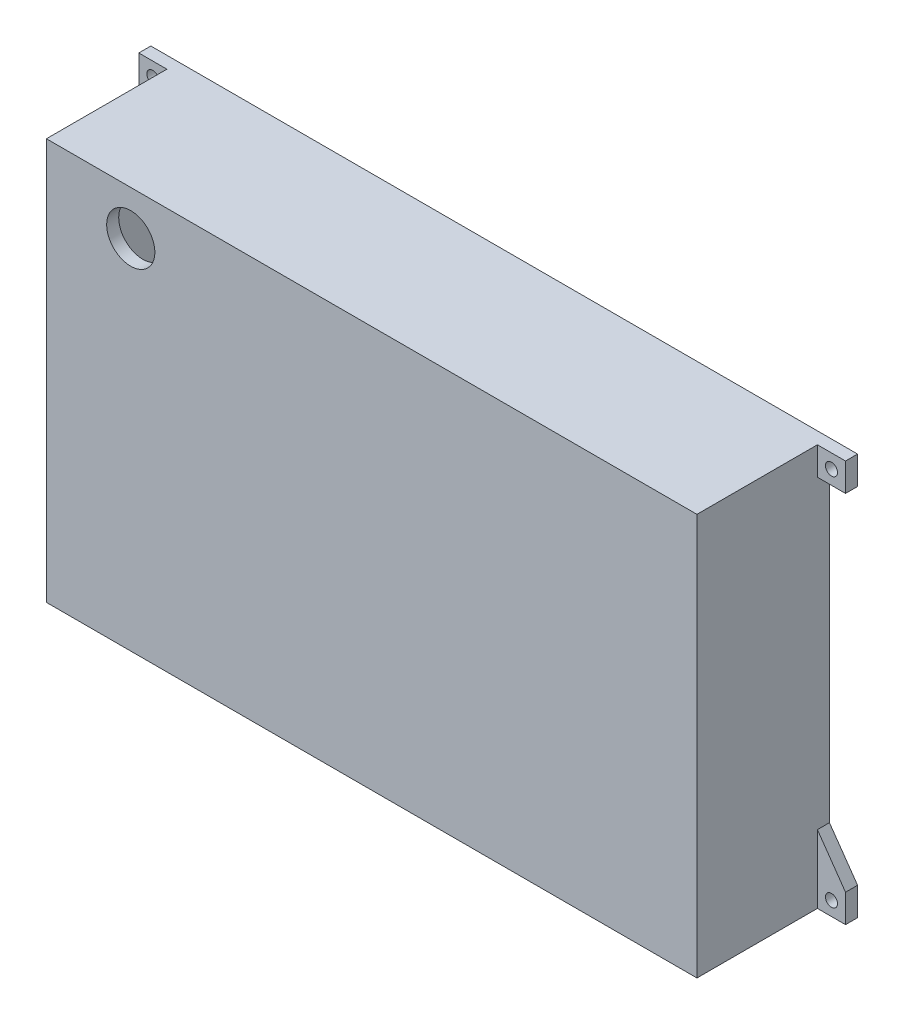
ISO-10303-21;
HEADER;
FILE_DESCRIPTION(('STEP AP214'),'2;1');
FILE_NAME('part.step','',(''),(''),'','','');
FILE_SCHEMA(('AUTOMOTIVE_DESIGN { 1 0 10303 214 1 1 1 1 }'));
ENDSEC;
DATA;
#1=APPLICATION_CONTEXT('core data for automotive mechanical design processes');
#2=APPLICATION_PROTOCOL_DEFINITION('international standard','automotive_design',2000,#1);
#3=PRODUCT_CONTEXT('',#1,'mechanical');
#4=PRODUCT('Part','Part','',(#3));
#5=PRODUCT_RELATED_PRODUCT_CATEGORY('part','',(#4));
#6=PRODUCT_DEFINITION_FORMATION('','',#4);
#7=PRODUCT_DEFINITION_CONTEXT('part definition',#1,'design');
#8=PRODUCT_DEFINITION('design','',#6,#7);
#9=PRODUCT_DEFINITION_SHAPE('','',#8);
#10=(LENGTH_UNIT() NAMED_UNIT(*) SI_UNIT(.MILLI.,.METRE.));
#11=(NAMED_UNIT(*) PLANE_ANGLE_UNIT() SI_UNIT($,.RADIAN.));
#12=(NAMED_UNIT(*) SI_UNIT($,.STERADIAN.) SOLID_ANGLE_UNIT());
#13=UNCERTAINTY_MEASURE_WITH_UNIT(LENGTH_MEASURE(1.E-05),#10,'distance_accuracy_value','');
#14=(GEOMETRIC_REPRESENTATION_CONTEXT(3) GLOBAL_UNCERTAINTY_ASSIGNED_CONTEXT((#13)) GLOBAL_UNIT_ASSIGNED_CONTEXT((#10,
#11,#12)) REPRESENTATION_CONTEXT('',''));
#15=CARTESIAN_POINT('',(0.,0.,0.));
#16=DIRECTION('',(0.,0.,1.));
#17=DIRECTION('',(1.,0.,0.));
#18=AXIS2_PLACEMENT_3D('',#15,#16,#17);
#19=CARTESIAN_POINT('',(0.,0.,33.));
#20=DIRECTION('',(0.,1.,0.));
#21=DIRECTION('',(0.,0.,1.));
#22=AXIS2_PLACEMENT_3D('',#19,#20,#21);
#23=PLANE('',#22);
#24=DIRECTION('',(0.,0.,-1.));
#25=VECTOR('',#24,1.);
#26=CARTESIAN_POINT('',(2.99999999999998,0.,30.));
#27=LINE('',#26,#25);
#28=CARTESIAN_POINT('',(2.99999999999998,0.,30.));
#29=VERTEX_POINT('',#28);
#30=CARTESIAN_POINT('',(2.99999999999998,0.,0.));
#31=VERTEX_POINT('',#30);
#32=EDGE_CURVE('E198',#29,#31,#27,.T.);
#33=ORIENTED_EDGE('',*,*,#32,.F.);
#34=DIRECTION('',(-1.,0.,0.));
#35=VECTOR('',#34,1.);
#36=CARTESIAN_POINT('',(159.,0.,30.));
#37=LINE('',#36,#35);
#38=CARTESIAN_POINT('',(159.,0.,30.));
#39=VERTEX_POINT('',#38);
#40=EDGE_CURVE('E184',#39,#29,#37,.T.);
#41=ORIENTED_EDGE('',*,*,#40,.F.);
#42=DIRECTION('',(0.,0.,-1.));
#43=VECTOR('',#42,1.);
#44=CARTESIAN_POINT('',(159.,0.,30.));
#45=LINE('',#44,#43);
#46=CARTESIAN_POINT('',(159.,0.,0.));
#47=VERTEX_POINT('',#46);
#48=EDGE_CURVE('E203',#39,#47,#45,.T.);
#49=ORIENTED_EDGE('',*,*,#48,.T.);
#50=DIRECTION('',(1.,0.,0.));
#51=VECTOR('',#50,1.);
#52=CARTESIAN_POINT('',(0.,0.,0.));
#53=LINE('',#52,#51);
#54=CARTESIAN_POINT('',(169.,0.,0.));
#55=VERTEX_POINT('',#54);
#56=EDGE_CURVE('E335',#47,#55,#53,.T.);
#57=ORIENTED_EDGE('',*,*,#56,.T.);
#58=DIRECTION('',(0.,0.,-1.));
#59=VECTOR('',#58,1.);
#60=CARTESIAN_POINT('',(169.,0.,3.));
#61=LINE('',#60,#59);
#62=CARTESIAN_POINT('',(169.,0.,3.));
#63=VERTEX_POINT('',#62);
#64=EDGE_CURVE('E246',#63,#55,#61,.T.);
#65=ORIENTED_EDGE('',*,*,#64,.F.);
#66=DIRECTION('',(1.,0.,0.));
#67=VECTOR('',#66,1.);
#68=CARTESIAN_POINT('',(0.,6.42343321390269E-13,3.));
#69=LINE('',#68,#67);
#70=CARTESIAN_POINT('',(162.,0.,3.));
#71=VERTEX_POINT('',#70);
#72=EDGE_CURVE('E241',#71,#63,#69,.T.);
#73=ORIENTED_EDGE('',*,*,#72,.F.);
#74=DIRECTION('',(0.,0.,-1.));
#75=VECTOR('',#74,1.);
#76=CARTESIAN_POINT('',(162.,0.,33.));
#77=LINE('',#76,#75);
#78=CARTESIAN_POINT('',(162.,0.,33.));
#79=VERTEX_POINT('',#78);
#80=EDGE_CURVE('E47',#79,#71,#77,.T.);
#81=ORIENTED_EDGE('',*,*,#80,.F.);
#82=DIRECTION('',(1.,0.,0.));
#83=VECTOR('',#82,1.);
#84=CARTESIAN_POINT('',(0.,0.,33.));
#85=LINE('',#84,#83);
#86=CARTESIAN_POINT('',(0.,0.,33.));
#87=VERTEX_POINT('',#86);
#88=EDGE_CURVE('E325',#87,#79,#85,.T.);
#89=ORIENTED_EDGE('',*,*,#88,.F.);
#90=DIRECTION('',(0.,0.,-1.));
#91=VECTOR('',#90,1.);
#92=CARTESIAN_POINT('',(0.,0.,33.));
#93=LINE('',#92,#91);
#94=CARTESIAN_POINT('',(0.,0.,3.));
#95=VERTEX_POINT('',#94);
#96=EDGE_CURVE('E11',#87,#95,#93,.T.);
#97=ORIENTED_EDGE('',*,*,#96,.T.);
#98=DIRECTION('',(-1.,0.,0.));
#99=VECTOR('',#98,1.);
#100=CARTESIAN_POINT('',(0.,0.,3.));
#101=LINE('',#100,#99);
#102=CARTESIAN_POINT('',(-7.00000000000001,0.,3.));
#103=VERTEX_POINT('',#102);
#104=EDGE_CURVE('E274',#95,#103,#101,.T.);
#105=ORIENTED_EDGE('',*,*,#104,.T.);
#106=DIRECTION('',(0.,0.,-1.));
#107=VECTOR('',#106,1.);
#108=CARTESIAN_POINT('',(-7.00000000000001,0.,3.));
#109=LINE('',#108,#107);
#110=CARTESIAN_POINT('',(-7.00000000000001,0.,0.));
#111=VERTEX_POINT('',#110);
#112=EDGE_CURVE('E277',#103,#111,#109,.T.);
#113=ORIENTED_EDGE('',*,*,#112,.T.);
#114=EDGE_CURVE('E336',#111,#31,#53,.T.);
#115=ORIENTED_EDGE('',*,*,#114,.T.);
#116=EDGE_LOOP('',(#33,#41,#49,#57,#65,#73,#81,#89,#97,#105,#113,#115));
#117=FACE_BOUND('',#116,.T.);
#118=ADVANCED_FACE('F38',(#117),#23,.F.);
#119=CARTESIAN_POINT('',(0.,0.,0.));
#120=DIRECTION('',(0.,0.,1.));
#121=DIRECTION('',(1.,0.,0.));
#122=AXIS2_PLACEMENT_3D('',#119,#120,#121);
#123=PLANE('',#122);
#124=CARTESIAN_POINT('',(165.5,96.5,0.));
#125=DIRECTION('',(0.,0.,1.));
#126=DIRECTION('',(1.,0.,0.));
#127=AXIS2_PLACEMENT_3D('',#124,#125,#126);
#128=CIRCLE('',#127,1.5);
#129=CARTESIAN_POINT('',(167.,96.5,0.));
#130=VERTEX_POINT('',#129);
#131=EDGE_CURVE('E210',#130,#130,#128,.T.);
#132=ORIENTED_EDGE('',*,*,#131,.T.);
#133=EDGE_LOOP('',(#132));
#134=FACE_BOUND('',#133,.T.);
#135=CARTESIAN_POINT('',(165.5,3.49999999999998,0.));
#136=DIRECTION('',(0.,0.,1.));
#137=DIRECTION('',(1.,0.,0.));
#138=AXIS2_PLACEMENT_3D('',#135,#136,#137);
#139=CIRCLE('',#138,1.5);
#140=CARTESIAN_POINT('',(167.,3.49999999999998,0.));
#141=VERTEX_POINT('',#140);
#142=EDGE_CURVE('E236',#141,#141,#139,.F.);
#143=ORIENTED_EDGE('',*,*,#142,.F.);
#144=EDGE_LOOP('',(#143));
#145=FACE_BOUND('',#144,.T.);
#146=CARTESIAN_POINT('',(-3.5,3.50000000000003,0.));
#147=DIRECTION('',(0.,0.,1.));
#148=DIRECTION('',(1.,0.,0.));
#149=AXIS2_PLACEMENT_3D('',#146,#147,#148);
#150=CIRCLE('',#149,1.5);
#151=CARTESIAN_POINT('',(-2.00000000000001,3.50000000000003,0.));
#152=VERTEX_POINT('',#151);
#153=EDGE_CURVE('E261',#152,#152,#150,.T.);
#154=ORIENTED_EDGE('',*,*,#153,.T.);
#155=EDGE_LOOP('',(#154));
#156=FACE_BOUND('',#155,.T.);
#157=CARTESIAN_POINT('',(-3.5,96.5,0.));
#158=DIRECTION('',(0.,0.,1.));
#159=DIRECTION('',(1.,0.,0.));
#160=AXIS2_PLACEMENT_3D('',#157,#158,#159);
#161=CIRCLE('',#160,1.5);
#162=CARTESIAN_POINT('',(-2.00000000000001,96.5,0.));
#163=VERTEX_POINT('',#162);
#164=EDGE_CURVE('E291',#163,#163,#161,.F.);
#165=ORIENTED_EDGE('',*,*,#164,.F.);
#166=EDGE_LOOP('',(#165));
#167=FACE_BOUND('',#166,.T.);
#168=DIRECTION('',(0.,-1.,0.));
#169=VECTOR('',#168,1.);
#170=CARTESIAN_POINT('',(3.,97.,0.));
#171=LINE('',#170,#169);
#172=CARTESIAN_POINT('',(3.,97.,0.));
#173=VERTEX_POINT('',#172);
#174=EDGE_CURVE('E196',#173,#31,#171,.T.);
#175=ORIENTED_EDGE('',*,*,#174,.T.);
#176=ORIENTED_EDGE('',*,*,#114,.F.);
#177=DIRECTION('',(0.,1.,0.));
#178=VECTOR('',#177,1.);
#179=CARTESIAN_POINT('',(-7.00000000000001,0.,0.));
#180=LINE('',#179,#178);
#181=CARTESIAN_POINT('',(-7.00000000000001,7.00000000000003,0.));
#182=VERTEX_POINT('',#181);
#183=EDGE_CURVE('E266',#111,#182,#180,.T.);
#184=ORIENTED_EDGE('',*,*,#183,.T.);
#185=DIRECTION('',(0.57346234436333,0.81923192051904,0.));
#186=VECTOR('',#185,1.);
#187=CARTESIAN_POINT('',(-7.98657718120807,5.59060402684567,0.));
#188=LINE('',#187,#186);
#189=CARTESIAN_POINT('',(0.,17.,0.));
#190=VERTEX_POINT('',#189);
#191=EDGE_CURVE('E280',#182,#190,#188,.T.);
#192=ORIENTED_EDGE('',*,*,#191,.T.);
#193=DIRECTION('',(0.,1.,0.));
#194=VECTOR('',#193,1.);
#195=CARTESIAN_POINT('',(0.,0.,0.));
#196=LINE('',#195,#194);
#197=CARTESIAN_POINT('',(0.,93.,0.));
#198=VERTEX_POINT('',#197);
#199=EDGE_CURVE('E321',#190,#198,#196,.T.);
#200=ORIENTED_EDGE('',*,*,#199,.T.);
#201=DIRECTION('',(-1.,0.,0.));
#202=VECTOR('',#201,1.);
#203=CARTESIAN_POINT('',(0.,93.,0.));
#204=LINE('',#203,#202);
#205=CARTESIAN_POINT('',(-7.00000000000001,93.,0.));
#206=VERTEX_POINT('',#205);
#207=EDGE_CURVE('E296',#198,#206,#204,.T.);
#208=ORIENTED_EDGE('',*,*,#207,.T.);
#209=DIRECTION('',(0.,-1.,0.));
#210=VECTOR('',#209,1.);
#211=CARTESIAN_POINT('',(-7.00000000000001,0.,0.));
#212=LINE('',#211,#210);
#213=CARTESIAN_POINT('',(-7.00000000000001,100.,0.));
#214=VERTEX_POINT('',#213);
#215=EDGE_CURVE('E309',#214,#206,#212,.T.);
#216=ORIENTED_EDGE('',*,*,#215,.F.);
#217=DIRECTION('',(1.,0.,0.));
#218=VECTOR('',#217,1.);
#219=CARTESIAN_POINT('',(0.,100.,0.));
#220=LINE('',#219,#218);
#221=CARTESIAN_POINT('',(169.,100.,0.));
#222=VERTEX_POINT('',#221);
#223=EDGE_CURVE('E326',#214,#222,#220,.T.);
#224=ORIENTED_EDGE('',*,*,#223,.T.);
#225=DIRECTION('',(0.,-1.,0.));
#226=VECTOR('',#225,1.);
#227=CARTESIAN_POINT('',(169.,0.,0.));
#228=LINE('',#227,#226);
#229=CARTESIAN_POINT('',(169.,93.,0.));
#230=VERTEX_POINT('',#229);
#231=EDGE_CURVE('E201',#222,#230,#228,.T.);
#232=ORIENTED_EDGE('',*,*,#231,.T.);
#233=DIRECTION('',(1.,0.,0.));
#234=VECTOR('',#233,1.);
#235=CARTESIAN_POINT('',(0.,93.,0.));
#236=LINE('',#235,#234);
#237=CARTESIAN_POINT('',(162.,93.,0.));
#238=VERTEX_POINT('',#237);
#239=EDGE_CURVE('E197',#238,#230,#236,.T.);
#240=ORIENTED_EDGE('',*,*,#239,.F.);
#241=DIRECTION('',(0.,1.,0.));
#242=VECTOR('',#241,1.);
#243=CARTESIAN_POINT('',(162.,0.,0.));
#244=LINE('',#243,#242);
#245=CARTESIAN_POINT('',(162.,17.,0.));
#246=VERTEX_POINT('',#245);
#247=EDGE_CURVE('E339',#246,#238,#244,.T.);
#248=ORIENTED_EDGE('',*,*,#247,.F.);
#249=DIRECTION('',(-0.573462344363328,0.819231920519041,0.));
#250=VECTOR('',#249,1.);
#251=CARTESIAN_POINT('',(116.711409395973,81.6979865771811,0.));
#252=LINE('',#251,#250);
#253=CARTESIAN_POINT('',(169.,6.99999999999998,0.));
#254=VERTEX_POINT('',#253);
#255=EDGE_CURVE('E249',#254,#246,#252,.T.);
#256=ORIENTED_EDGE('',*,*,#255,.F.);
#257=DIRECTION('',(0.,1.,0.));
#258=VECTOR('',#257,1.);
#259=CARTESIAN_POINT('',(169.,0.,0.));
#260=LINE('',#259,#258);
#261=EDGE_CURVE('E231',#55,#254,#260,.T.);
#262=ORIENTED_EDGE('',*,*,#261,.F.);
#263=ORIENTED_EDGE('',*,*,#56,.F.);
#264=DIRECTION('',(0.,-1.,0.));
#265=VECTOR('',#264,1.);
#266=CARTESIAN_POINT('',(159.,97.,0.));
#267=LINE('',#266,#265);
#268=CARTESIAN_POINT('',(159.,97.,0.));
#269=VERTEX_POINT('',#268);
#270=EDGE_CURVE('E192',#269,#47,#267,.T.);
#271=ORIENTED_EDGE('',*,*,#270,.F.);
#272=DIRECTION('',(-1.,0.,0.));
#273=VECTOR('',#272,1.);
#274=CARTESIAN_POINT('',(159.,97.,0.));
#275=LINE('',#274,#273);
#276=EDGE_CURVE('E54',#269,#173,#275,.T.);
#277=ORIENTED_EDGE('',*,*,#276,.T.);
#278=EDGE_LOOP('',(#175,#176,#184,#192,#200,#208,#216,#224,#232,#240,#248,#256,#262,#263,#271,#277));
#279=FACE_BOUND('',#278,.T.);
#280=ADVANCED_FACE('F368',(#134,#145,#156,#167,#279),#123,.F.);
#281=CARTESIAN_POINT('',(162.,0.,33.));
#282=DIRECTION('',(-1.,0.,0.));
#283=DIRECTION('',(0.,0.,1.));
#284=AXIS2_PLACEMENT_3D('',#281,#282,#283);
#285=PLANE('',#284);
#286=DIRECTION('',(0.,0.,-1.));
#287=VECTOR('',#286,1.);
#288=CARTESIAN_POINT('',(162.,93.,3.));
#289=LINE('',#288,#287);
#290=CARTESIAN_POINT('',(162.,93.,3.));
#291=VERTEX_POINT('',#290);
#292=EDGE_CURVE('E62',#291,#238,#289,.T.);
#293=ORIENTED_EDGE('',*,*,#292,.F.);
#294=DIRECTION('',(0.,1.,0.));
#295=VECTOR('',#294,1.);
#296=CARTESIAN_POINT('',(162.,0.,3.));
#297=LINE('',#296,#295);
#298=CARTESIAN_POINT('',(162.,100.,3.));
#299=VERTEX_POINT('',#298);
#300=EDGE_CURVE('E207',#291,#299,#297,.T.);
#301=ORIENTED_EDGE('',*,*,#300,.T.);
#302=DIRECTION('',(0.,0.,-1.));
#303=VECTOR('',#302,1.);
#304=CARTESIAN_POINT('',(162.,100.,33.));
#305=LINE('',#304,#303);
#306=CARTESIAN_POINT('',(162.,100.,33.));
#307=VERTEX_POINT('',#306);
#308=EDGE_CURVE('E344',#307,#299,#305,.T.);
#309=ORIENTED_EDGE('',*,*,#308,.F.);
#310=DIRECTION('',(0.,1.,0.));
#311=VECTOR('',#310,1.);
#312=CARTESIAN_POINT('',(162.,0.,33.));
#313=LINE('',#312,#311);
#314=EDGE_CURVE('E328',#79,#307,#313,.T.);
#315=ORIENTED_EDGE('',*,*,#314,.F.);
#316=ORIENTED_EDGE('',*,*,#80,.T.);
#317=DIRECTION('',(0.,1.,0.));
#318=VECTOR('',#317,1.);
#319=CARTESIAN_POINT('',(162.,0.,3.));
#320=LINE('',#319,#318);
#321=CARTESIAN_POINT('',(162.,17.,3.));
#322=VERTEX_POINT('',#321);
#323=EDGE_CURVE('E238',#71,#322,#320,.T.);
#324=ORIENTED_EDGE('',*,*,#323,.T.);
#325=DIRECTION('',(0.,0.,-1.));
#326=VECTOR('',#325,1.);
#327=CARTESIAN_POINT('',(162.,17.,3.));
#328=LINE('',#327,#326);
#329=EDGE_CURVE('E255',#322,#246,#328,.T.);
#330=ORIENTED_EDGE('',*,*,#329,.T.);
#331=ORIENTED_EDGE('',*,*,#247,.T.);
#332=EDGE_LOOP('',(#293,#301,#309,#315,#316,#324,#330,#331));
#333=FACE_BOUND('',#332,.T.);
#334=ADVANCED_FACE('F350',(#333),#285,.F.);
#335=CARTESIAN_POINT('',(0.,0.,33.));
#336=DIRECTION('',(-1.,0.,0.));
#337=DIRECTION('',(0.,0.,1.));
#338=AXIS2_PLACEMENT_3D('',#335,#336,#337);
#339=PLANE('',#338);
#340=DIRECTION('',(0.,0.,-1.));
#341=VECTOR('',#340,1.);
#342=CARTESIAN_POINT('',(0.,17.,3.));
#343=LINE('',#342,#341);
#344=CARTESIAN_POINT('',(0.,17.,3.));
#345=VERTEX_POINT('',#344);
#346=EDGE_CURVE('E288',#345,#190,#343,.T.);
#347=ORIENTED_EDGE('',*,*,#346,.F.);
#348=DIRECTION('',(0.,1.,0.));
#349=VECTOR('',#348,1.);
#350=CARTESIAN_POINT('',(0.,0.,3.));
#351=LINE('',#350,#349);
#352=EDGE_CURVE('E265',#95,#345,#351,.T.);
#353=ORIENTED_EDGE('',*,*,#352,.F.);
#354=ORIENTED_EDGE('',*,*,#96,.F.);
#355=DIRECTION('',(0.,1.,0.));
#356=VECTOR('',#355,1.);
#357=CARTESIAN_POINT('',(0.,0.,33.));
#358=LINE('',#357,#356);
#359=CARTESIAN_POINT('',(0.,100.,33.));
#360=VERTEX_POINT('',#359);
#361=EDGE_CURVE('E322',#87,#360,#358,.T.);
#362=ORIENTED_EDGE('',*,*,#361,.T.);
#363=DIRECTION('',(0.,0.,-1.));
#364=VECTOR('',#363,1.);
#365=CARTESIAN_POINT('',(0.,100.,33.));
#366=LINE('',#365,#364);
#367=CARTESIAN_POINT('',(0.,100.,3.));
#368=VERTEX_POINT('',#367);
#369=EDGE_CURVE('E333',#360,#368,#366,.T.);
#370=ORIENTED_EDGE('',*,*,#369,.T.);
#371=DIRECTION('',(0.,1.,0.));
#372=VECTOR('',#371,1.);
#373=CARTESIAN_POINT('',(0.,0.,3.));
#374=LINE('',#373,#372);
#375=CARTESIAN_POINT('',(0.,93.,3.));
#376=VERTEX_POINT('',#375);
#377=EDGE_CURVE('E304',#376,#368,#374,.T.);
#378=ORIENTED_EDGE('',*,*,#377,.F.);
#379=DIRECTION('',(0.,0.,-1.));
#380=VECTOR('',#379,1.);
#381=CARTESIAN_POINT('',(0.,93.,3.));
#382=LINE('',#381,#380);
#383=EDGE_CURVE('E306',#376,#198,#382,.T.);
#384=ORIENTED_EDGE('',*,*,#383,.T.);
#385=ORIENTED_EDGE('',*,*,#199,.F.);
#386=EDGE_LOOP('',(#347,#353,#354,#362,#370,#378,#384,#385));
#387=FACE_BOUND('',#386,.T.);
#388=ADVANCED_FACE('F40',(#387),#339,.T.);
#389=CARTESIAN_POINT('',(0.,100.,33.));
#390=DIRECTION('',(0.,1.,0.));
#391=DIRECTION('',(0.,0.,1.));
#392=AXIS2_PLACEMENT_3D('',#389,#390,#391);
#393=PLANE('',#392);
#394=ORIENTED_EDGE('',*,*,#223,.F.);
#395=DIRECTION('',(0.,0.,-1.));
#396=VECTOR('',#395,1.);
#397=CARTESIAN_POINT('',(-7.00000000000001,100.,3.));
#398=LINE('',#397,#396);
#399=CARTESIAN_POINT('',(-7.00000000000001,100.,3.));
#400=VERTEX_POINT('',#399);
#401=EDGE_CURVE('E318',#400,#214,#398,.T.);
#402=ORIENTED_EDGE('',*,*,#401,.F.);
#403=DIRECTION('',(-1.,0.,0.));
#404=VECTOR('',#403,1.);
#405=CARTESIAN_POINT('',(0.,100.,3.));
#406=LINE('',#405,#404);
#407=EDGE_CURVE('E295',#368,#400,#406,.T.);
#408=ORIENTED_EDGE('',*,*,#407,.F.);
#409=ORIENTED_EDGE('',*,*,#369,.F.);
#410=DIRECTION('',(1.,0.,0.));
#411=VECTOR('',#410,1.);
#412=CARTESIAN_POINT('',(0.,100.,33.));
#413=LINE('',#412,#411);
#414=EDGE_CURVE('E330',#360,#307,#413,.T.);
#415=ORIENTED_EDGE('',*,*,#414,.T.);
#416=ORIENTED_EDGE('',*,*,#308,.T.);
#417=DIRECTION('',(1.,0.,0.));
#418=VECTOR('',#417,1.);
#419=CARTESIAN_POINT('',(0.,100.,3.));
#420=LINE('',#419,#418);
#421=CARTESIAN_POINT('',(169.,100.,3.));
#422=VERTEX_POINT('',#421);
#423=EDGE_CURVE('E215',#299,#422,#420,.T.);
#424=ORIENTED_EDGE('',*,*,#423,.T.);
#425=DIRECTION('',(0.,0.,-1.));
#426=VECTOR('',#425,1.);
#427=CARTESIAN_POINT('',(169.,100.,3.));
#428=LINE('',#427,#426);
#429=EDGE_CURVE('E220',#422,#222,#428,.T.);
#430=ORIENTED_EDGE('',*,*,#429,.T.);
#431=EDGE_LOOP('',(#394,#402,#408,#409,#415,#416,#424,#430));
#432=FACE_BOUND('',#431,.T.);
#433=ADVANCED_FACE('F381',(#432),#393,.T.);
#434=CARTESIAN_POINT('',(0.,0.,33.));
#435=DIRECTION('',(0.,0.,1.));
#436=DIRECTION('',(1.,0.,0.));
#437=AXIS2_PLACEMENT_3D('',#434,#435,#436);
#438=PLANE('',#437);
#439=CARTESIAN_POINT('',(21.,89.,33.));
#440=DIRECTION('',(0.,0.,-1.));
#441=DIRECTION('',(-1.,0.,0.));
#442=AXIS2_PLACEMENT_3D('',#439,#440,#441);
#443=CIRCLE('',#442,6.00000000000001);
#444=CARTESIAN_POINT('',(15.,89.,33.));
#445=VERTEX_POINT('',#444);
#446=EDGE_CURVE('E626',#445,#445,#443,.T.);
#447=ORIENTED_EDGE('',*,*,#446,.T.);
#448=EDGE_LOOP('',(#447));
#449=FACE_BOUND('',#448,.T.);
#450=ORIENTED_EDGE('',*,*,#361,.F.);
#451=ORIENTED_EDGE('',*,*,#88,.T.);
#452=ORIENTED_EDGE('',*,*,#314,.T.);
#453=ORIENTED_EDGE('',*,*,#414,.F.);
#454=EDGE_LOOP('',(#450,#451,#452,#453));
#455=FACE_BOUND('',#454,.T.);
#456=ADVANCED_FACE('F385',(#449,#455),#438,.T.);
#457=CARTESIAN_POINT('',(-7.00000000000001,0.,3.));
#458=DIRECTION('',(1.,0.,0.));
#459=DIRECTION('',(0.,0.,-1.));
#460=AXIS2_PLACEMENT_3D('',#457,#458,#459);
#461=PLANE('',#460);
#462=ORIENTED_EDGE('',*,*,#215,.T.);
#463=DIRECTION('',(0.,0.,-1.));
#464=VECTOR('',#463,1.);
#465=CARTESIAN_POINT('',(-7.00000000000001,93.,3.));
#466=LINE('',#465,#464);
#467=CARTESIAN_POINT('',(-7.00000000000001,93.,3.));
#468=VERTEX_POINT('',#467);
#469=EDGE_CURVE('E316',#468,#206,#466,.T.);
#470=ORIENTED_EDGE('',*,*,#469,.F.);
#471=DIRECTION('',(0.,-1.,0.));
#472=VECTOR('',#471,1.);
#473=CARTESIAN_POINT('',(-7.00000000000001,0.,3.));
#474=LINE('',#473,#472);
#475=EDGE_CURVE('E299',#400,#468,#474,.T.);
#476=ORIENTED_EDGE('',*,*,#475,.F.);
#477=ORIENTED_EDGE('',*,*,#401,.T.);
#478=EDGE_LOOP('',(#462,#470,#476,#477));
#479=FACE_BOUND('',#478,.T.);
#480=ADVANCED_FACE('F436',(#479),#461,.F.);
#481=CARTESIAN_POINT('',(0.,93.,3.));
#482=DIRECTION('',(0.,-1.,0.));
#483=DIRECTION('',(0.,0.,-1.));
#484=AXIS2_PLACEMENT_3D('',#481,#482,#483);
#485=PLANE('',#484);
#486=ORIENTED_EDGE('',*,*,#207,.F.);
#487=ORIENTED_EDGE('',*,*,#383,.F.);
#488=DIRECTION('',(-1.,0.,0.));
#489=VECTOR('',#488,1.);
#490=CARTESIAN_POINT('',(0.,93.,3.));
#491=LINE('',#490,#489);
#492=EDGE_CURVE('E301',#376,#468,#491,.T.);
#493=ORIENTED_EDGE('',*,*,#492,.T.);
#494=ORIENTED_EDGE('',*,*,#469,.T.);
#495=EDGE_LOOP('',(#486,#487,#493,#494));
#496=FACE_BOUND('',#495,.T.);
#497=ADVANCED_FACE('F442',(#496),#485,.T.);
#498=CARTESIAN_POINT('',(-3.5,96.5,3.));
#499=DIRECTION('',(0.,0.,-1.));
#500=DIRECTION('',(-1.,0.,0.));
#501=AXIS2_PLACEMENT_3D('',#498,#499,#500);
#502=CYLINDRICAL_SURFACE('',#501,1.5);
#503=CARTESIAN_POINT('',(-3.5,96.5,3.));
#504=DIRECTION('',(0.,0.,1.));
#505=DIRECTION('',(1.,0.,0.));
#506=AXIS2_PLACEMENT_3D('',#503,#504,#505);
#507=CIRCLE('',#506,1.5);
#508=CARTESIAN_POINT('',(-2.00000000000001,96.5,3.));
#509=VERTEX_POINT('',#508);
#510=EDGE_CURVE('E292',#509,#509,#507,.F.);
#511=ORIENTED_EDGE('',*,*,#510,.F.);
#512=EDGE_LOOP('',(#511));
#513=FACE_BOUND('',#512,.T.);
#514=ORIENTED_EDGE('',*,*,#164,.T.);
#515=EDGE_LOOP('',(#514));
#516=FACE_BOUND('',#515,.T.);
#517=ADVANCED_FACE('F438',(#513,#516),#502,.F.);
#518=CARTESIAN_POINT('',(0.,0.,3.));
#519=DIRECTION('',(0.,0.,1.));
#520=DIRECTION('',(1.,0.,0.));
#521=AXIS2_PLACEMENT_3D('',#518,#519,#520);
#522=PLANE('',#521);
#523=ORIENTED_EDGE('',*,*,#510,.T.);
#524=EDGE_LOOP('',(#523));
#525=FACE_BOUND('',#524,.T.);
#526=ORIENTED_EDGE('',*,*,#407,.T.);
#527=ORIENTED_EDGE('',*,*,#475,.T.);
#528=ORIENTED_EDGE('',*,*,#492,.F.);
#529=ORIENTED_EDGE('',*,*,#377,.T.);
#530=EDGE_LOOP('',(#526,#527,#528,#529));
#531=FACE_BOUND('',#530,.T.);
#532=ADVANCED_FACE('F441',(#525,#531),#522,.T.);
#533=CARTESIAN_POINT('',(-7.98657718120807,5.59060402684567,3.));
#534=DIRECTION('',(-0.819231920519039,0.57346234436333,0.));
#535=DIRECTION('',(-0.57346234436333,-0.81923192051904,0.));
#536=AXIS2_PLACEMENT_3D('',#533,#534,#535);
#537=PLANE('',#536);
#538=ORIENTED_EDGE('',*,*,#191,.F.);
#539=DIRECTION('',(0.,0.,-1.));
#540=VECTOR('',#539,1.);
#541=CARTESIAN_POINT('',(-7.00000000000001,7.00000000000003,3.));
#542=LINE('',#541,#540);
#543=CARTESIAN_POINT('',(-7.00000000000001,7.00000000000003,3.));
#544=VERTEX_POINT('',#543);
#545=EDGE_CURVE('E286',#544,#182,#542,.T.);
#546=ORIENTED_EDGE('',*,*,#545,.F.);
#547=DIRECTION('',(0.57346234436333,0.81923192051904,0.));
#548=VECTOR('',#547,1.);
#549=CARTESIAN_POINT('',(-7.98657718120807,5.59060402684567,3.));
#550=LINE('',#549,#548);
#551=EDGE_CURVE('E268',#544,#345,#550,.T.);
#552=ORIENTED_EDGE('',*,*,#551,.T.);
#553=ORIENTED_EDGE('',*,*,#346,.T.);
#554=EDGE_LOOP('',(#538,#546,#552,#553));
#555=FACE_BOUND('',#554,.T.);
#556=ADVANCED_FACE('F452',(#555),#537,.T.);
#557=CARTESIAN_POINT('',(-7.00000000000001,0.,3.));
#558=DIRECTION('',(-1.,0.,0.));
#559=DIRECTION('',(0.,0.,1.));
#560=AXIS2_PLACEMENT_3D('',#557,#558,#559);
#561=PLANE('',#560);
#562=ORIENTED_EDGE('',*,*,#183,.F.);
#563=ORIENTED_EDGE('',*,*,#112,.F.);
#564=DIRECTION('',(0.,1.,0.));
#565=VECTOR('',#564,1.);
#566=CARTESIAN_POINT('',(-7.00000000000001,0.,3.));
#567=LINE('',#566,#565);
#568=EDGE_CURVE('E271',#103,#544,#567,.T.);
#569=ORIENTED_EDGE('',*,*,#568,.T.);
#570=ORIENTED_EDGE('',*,*,#545,.T.);
#571=EDGE_LOOP('',(#562,#563,#569,#570));
#572=FACE_BOUND('',#571,.T.);
#573=ADVANCED_FACE('F396',(#572),#561,.T.);
#574=CARTESIAN_POINT('',(-3.5,3.50000000000003,3.));
#575=DIRECTION('',(0.,0.,-1.));
#576=DIRECTION('',(-1.,0.,0.));
#577=AXIS2_PLACEMENT_3D('',#574,#575,#576);
#578=CYLINDRICAL_SURFACE('',#577,1.5);
#579=CARTESIAN_POINT('',(-3.5,3.50000000000003,3.));
#580=DIRECTION('',(0.,0.,1.));
#581=DIRECTION('',(1.,0.,0.));
#582=AXIS2_PLACEMENT_3D('',#579,#580,#581);
#583=CIRCLE('',#582,1.5);
#584=CARTESIAN_POINT('',(-2.00000000000001,3.50000000000003,3.));
#585=VERTEX_POINT('',#584);
#586=EDGE_CURVE('E262',#585,#585,#583,.T.);
#587=ORIENTED_EDGE('',*,*,#586,.T.);
#588=EDGE_LOOP('',(#587));
#589=FACE_BOUND('',#588,.T.);
#590=ORIENTED_EDGE('',*,*,#153,.F.);
#591=EDGE_LOOP('',(#590));
#592=FACE_BOUND('',#591,.T.);
#593=ADVANCED_FACE('F420',(#589,#592),#578,.F.);
#594=CARTESIAN_POINT('',(0.,0.,3.));
#595=DIRECTION('',(0.,0.,1.));
#596=DIRECTION('',(1.,0.,0.));
#597=AXIS2_PLACEMENT_3D('',#594,#595,#596);
#598=PLANE('',#597);
#599=ORIENTED_EDGE('',*,*,#586,.F.);
#600=EDGE_LOOP('',(#599));
#601=FACE_BOUND('',#600,.T.);
#602=ORIENTED_EDGE('',*,*,#352,.T.);
#603=ORIENTED_EDGE('',*,*,#551,.F.);
#604=ORIENTED_EDGE('',*,*,#568,.F.);
#605=ORIENTED_EDGE('',*,*,#104,.F.);
#606=EDGE_LOOP('',(#602,#603,#604,#605));
#607=FACE_BOUND('',#606,.T.);
#608=ADVANCED_FACE('F393',(#601,#607),#598,.T.);
#609=CARTESIAN_POINT('',(169.,0.,3.));
#610=DIRECTION('',(-1.,0.,0.));
#611=DIRECTION('',(0.,0.,1.));
#612=AXIS2_PLACEMENT_3D('',#609,#610,#611);
#613=PLANE('',#612);
#614=ORIENTED_EDGE('',*,*,#261,.T.);
#615=DIRECTION('',(0.,0.,-1.));
#616=VECTOR('',#615,1.);
#617=CARTESIAN_POINT('',(169.,6.99999999999998,3.));
#618=LINE('',#617,#616);
#619=CARTESIAN_POINT('',(169.,6.99999999999998,3.));
#620=VERTEX_POINT('',#619);
#621=EDGE_CURVE('E258',#620,#254,#618,.T.);
#622=ORIENTED_EDGE('',*,*,#621,.F.);
#623=DIRECTION('',(0.,1.,0.));
#624=VECTOR('',#623,1.);
#625=CARTESIAN_POINT('',(169.,0.,3.));
#626=LINE('',#625,#624);
#627=EDGE_CURVE('E232',#63,#620,#626,.T.);
#628=ORIENTED_EDGE('',*,*,#627,.F.);
#629=ORIENTED_EDGE('',*,*,#64,.T.);
#630=EDGE_LOOP('',(#614,#622,#628,#629));
#631=FACE_BOUND('',#630,.T.);
#632=ADVANCED_FACE('F411',(#631),#613,.F.);
#633=CARTESIAN_POINT('',(116.711409395973,81.6979865771811,3.));
#634=DIRECTION('',(-0.819231920519041,-0.573462344363327,0.));
#635=DIRECTION('',(0.573462344363328,-0.819231920519041,0.));
#636=AXIS2_PLACEMENT_3D('',#633,#634,#635);
#637=PLANE('',#636);
#638=ORIENTED_EDGE('',*,*,#255,.T.);
#639=ORIENTED_EDGE('',*,*,#329,.F.);
#640=DIRECTION('',(-0.573462344363328,0.819231920519041,0.));
#641=VECTOR('',#640,1.);
#642=CARTESIAN_POINT('',(116.711409395973,81.6979865771811,3.));
#643=LINE('',#642,#641);
#644=EDGE_CURVE('E235',#620,#322,#643,.T.);
#645=ORIENTED_EDGE('',*,*,#644,.F.);
#646=ORIENTED_EDGE('',*,*,#621,.T.);
#647=EDGE_LOOP('',(#638,#639,#645,#646));
#648=FACE_BOUND('',#647,.T.);
#649=ADVANCED_FACE('F364',(#648),#637,.F.);
#650=CARTESIAN_POINT('',(165.5,3.49999999999998,3.));
#651=DIRECTION('',(0.,0.,-1.));
#652=DIRECTION('',(-1.,0.,0.));
#653=AXIS2_PLACEMENT_3D('',#650,#651,#652);
#654=CYLINDRICAL_SURFACE('',#653,1.5);
#655=CARTESIAN_POINT('',(165.5,3.49999999999998,3.));
#656=DIRECTION('',(0.,0.,1.));
#657=DIRECTION('',(1.,0.,0.));
#658=AXIS2_PLACEMENT_3D('',#655,#656,#657);
#659=CIRCLE('',#658,1.5);
#660=CARTESIAN_POINT('',(167.,3.49999999999998,3.));
#661=VERTEX_POINT('',#660);
#662=EDGE_CURVE('E243',#661,#661,#659,.F.);
#663=ORIENTED_EDGE('',*,*,#662,.F.);
#664=EDGE_LOOP('',(#663));
#665=FACE_BOUND('',#664,.T.);
#666=ORIENTED_EDGE('',*,*,#142,.T.);
#667=EDGE_LOOP('',(#666));
#668=FACE_BOUND('',#667,.T.);
#669=ADVANCED_FACE('F418',(#665,#668),#654,.F.);
#670=CARTESIAN_POINT('',(0.,0.,3.));
#671=DIRECTION('',(0.,0.,1.));
#672=DIRECTION('',(1.,0.,0.));
#673=AXIS2_PLACEMENT_3D('',#670,#671,#672);
#674=PLANE('',#673);
#675=ORIENTED_EDGE('',*,*,#627,.T.);
#676=ORIENTED_EDGE('',*,*,#644,.T.);
#677=ORIENTED_EDGE('',*,*,#323,.F.);
#678=ORIENTED_EDGE('',*,*,#72,.T.);
#679=EDGE_LOOP('',(#675,#676,#677,#678));
#680=FACE_BOUND('',#679,.T.);
#681=ORIENTED_EDGE('',*,*,#662,.T.);
#682=EDGE_LOOP('',(#681));
#683=FACE_BOUND('',#682,.T.);
#684=ADVANCED_FACE('F359',(#680,#683),#674,.T.);
#685=CARTESIAN_POINT('',(0.,93.,3.));
#686=DIRECTION('',(0.,1.,0.));
#687=DIRECTION('',(0.,0.,1.));
#688=AXIS2_PLACEMENT_3D('',#685,#686,#687);
#689=PLANE('',#688);
#690=ORIENTED_EDGE('',*,*,#239,.T.);
#691=DIRECTION('',(0.,0.,-1.));
#692=VECTOR('',#691,1.);
#693=CARTESIAN_POINT('',(169.,93.,3.));
#694=LINE('',#693,#692);
#695=CARTESIAN_POINT('',(169.,93.,3.));
#696=VERTEX_POINT('',#695);
#697=EDGE_CURVE('E228',#696,#230,#694,.T.);
#698=ORIENTED_EDGE('',*,*,#697,.F.);
#699=DIRECTION('',(1.,0.,0.));
#700=VECTOR('',#699,1.);
#701=CARTESIAN_POINT('',(0.,93.,3.));
#702=LINE('',#701,#700);
#703=EDGE_CURVE('E209',#291,#696,#702,.T.);
#704=ORIENTED_EDGE('',*,*,#703,.F.);
#705=ORIENTED_EDGE('',*,*,#292,.T.);
#706=EDGE_LOOP('',(#690,#698,#704,#705));
#707=FACE_BOUND('',#706,.T.);
#708=ADVANCED_FACE('F373',(#707),#689,.F.);
#709=CARTESIAN_POINT('',(169.,0.,3.));
#710=DIRECTION('',(1.,0.,0.));
#711=DIRECTION('',(0.,0.,-1.));
#712=AXIS2_PLACEMENT_3D('',#709,#710,#711);
#713=PLANE('',#712);
#714=ORIENTED_EDGE('',*,*,#231,.F.);
#715=ORIENTED_EDGE('',*,*,#429,.F.);
#716=DIRECTION('',(0.,-1.,0.));
#717=VECTOR('',#716,1.);
#718=CARTESIAN_POINT('',(169.,0.,3.));
#719=LINE('',#718,#717);
#720=EDGE_CURVE('E212',#422,#696,#719,.T.);
#721=ORIENTED_EDGE('',*,*,#720,.T.);
#722=ORIENTED_EDGE('',*,*,#697,.T.);
#723=EDGE_LOOP('',(#714,#715,#721,#722));
#724=FACE_BOUND('',#723,.T.);
#725=ADVANCED_FACE('F514',(#724),#713,.T.);
#726=CARTESIAN_POINT('',(165.5,96.5,3.));
#727=DIRECTION('',(0.,0.,-1.));
#728=DIRECTION('',(-1.,0.,0.));
#729=AXIS2_PLACEMENT_3D('',#726,#727,#728);
#730=CYLINDRICAL_SURFACE('',#729,1.5);
#731=CARTESIAN_POINT('',(165.5,96.5,3.));
#732=DIRECTION('',(0.,0.,1.));
#733=DIRECTION('',(1.,0.,0.));
#734=AXIS2_PLACEMENT_3D('',#731,#732,#733);
#735=CIRCLE('',#734,1.5);
#736=CARTESIAN_POINT('',(167.,96.5,3.));
#737=VERTEX_POINT('',#736);
#738=EDGE_CURVE('E218',#737,#737,#735,.T.);
#739=ORIENTED_EDGE('',*,*,#738,.T.);
#740=EDGE_LOOP('',(#739));
#741=FACE_BOUND('',#740,.T.);
#742=ORIENTED_EDGE('',*,*,#131,.F.);
#743=EDGE_LOOP('',(#742));
#744=FACE_BOUND('',#743,.T.);
#745=ADVANCED_FACE('F524',(#741,#744),#730,.F.);
#746=CARTESIAN_POINT('',(0.,0.,3.));
#747=DIRECTION('',(0.,0.,1.));
#748=DIRECTION('',(1.,0.,0.));
#749=AXIS2_PLACEMENT_3D('',#746,#747,#748);
#750=PLANE('',#749);
#751=ORIENTED_EDGE('',*,*,#300,.F.);
#752=ORIENTED_EDGE('',*,*,#703,.T.);
#753=ORIENTED_EDGE('',*,*,#720,.F.);
#754=ORIENTED_EDGE('',*,*,#423,.F.);
#755=EDGE_LOOP('',(#751,#752,#753,#754));
#756=FACE_BOUND('',#755,.T.);
#757=ORIENTED_EDGE('',*,*,#738,.F.);
#758=EDGE_LOOP('',(#757));
#759=FACE_BOUND('',#758,.T.);
#760=ADVANCED_FACE('F378',(#756,#759),#750,.T.);
#761=CARTESIAN_POINT('',(159.,97.,30.));
#762=DIRECTION('',(0.,-1.,0.));
#763=DIRECTION('',(1.,0.,0.));
#764=AXIS2_PLACEMENT_3D('',#761,#762,#763);
#765=PLANE('',#764);
#766=ORIENTED_EDGE('',*,*,#276,.F.);
#767=DIRECTION('',(0.,0.,-1.));
#768=VECTOR('',#767,1.);
#769=CARTESIAN_POINT('',(159.,97.,30.));
#770=LINE('',#769,#768);
#771=CARTESIAN_POINT('',(159.,97.,30.));
#772=VERTEX_POINT('',#771);
#773=EDGE_CURVE('E191',#772,#269,#770,.T.);
#774=ORIENTED_EDGE('',*,*,#773,.F.);
#775=DIRECTION('',(-1.,0.,0.));
#776=VECTOR('',#775,1.);
#777=CARTESIAN_POINT('',(159.,97.,30.));
#778=LINE('',#777,#776);
#779=CARTESIAN_POINT('',(3.,97.,30.));
#780=VERTEX_POINT('',#779);
#781=EDGE_CURVE('E181',#772,#780,#778,.T.);
#782=ORIENTED_EDGE('',*,*,#781,.T.);
#783=DIRECTION('',(0.,0.,-1.));
#784=VECTOR('',#783,1.);
#785=CARTESIAN_POINT('',(3.,97.,30.));
#786=LINE('',#785,#784);
#787=EDGE_CURVE('E190',#780,#173,#786,.T.);
#788=ORIENTED_EDGE('',*,*,#787,.T.);
#789=EDGE_LOOP('',(#766,#774,#782,#788));
#790=FACE_BOUND('',#789,.T.);
#791=ADVANCED_FACE('F189',(#790),#765,.T.);
#792=CARTESIAN_POINT('',(3.,97.,30.));
#793=DIRECTION('',(1.,0.,0.));
#794=DIRECTION('',(0.,1.,0.));
#795=AXIS2_PLACEMENT_3D('',#792,#793,#794);
#796=PLANE('',#795);
#797=ORIENTED_EDGE('',*,*,#174,.F.);
#798=ORIENTED_EDGE('',*,*,#787,.F.);
#799=DIRECTION('',(0.,-1.,0.));
#800=VECTOR('',#799,1.);
#801=CARTESIAN_POINT('',(3.,97.,30.));
#802=LINE('',#801,#800);
#803=EDGE_CURVE('E177',#780,#29,#802,.T.);
#804=ORIENTED_EDGE('',*,*,#803,.T.);
#805=ORIENTED_EDGE('',*,*,#32,.T.);
#806=EDGE_LOOP('',(#797,#798,#804,#805));
#807=FACE_BOUND('',#806,.T.);
#808=ADVANCED_FACE('F194',(#807),#796,.T.);
#809=CARTESIAN_POINT('',(159.,97.,30.));
#810=DIRECTION('',(1.,0.,0.));
#811=DIRECTION('',(0.,0.,-1.));
#812=AXIS2_PLACEMENT_3D('',#809,#810,#811);
#813=PLANE('',#812);
#814=ORIENTED_EDGE('',*,*,#270,.T.);
#815=ORIENTED_EDGE('',*,*,#48,.F.);
#816=DIRECTION('',(0.,-1.,0.));
#817=VECTOR('',#816,1.);
#818=CARTESIAN_POINT('',(159.,97.,30.));
#819=LINE('',#818,#817);
#820=EDGE_CURVE('E400',#772,#39,#819,.T.);
#821=ORIENTED_EDGE('',*,*,#820,.F.);
#822=ORIENTED_EDGE('',*,*,#773,.T.);
#823=EDGE_LOOP('',(#814,#815,#821,#822));
#824=FACE_BOUND('',#823,.T.);
#825=ADVANCED_FACE('F409',(#824),#813,.F.);
#826=CARTESIAN_POINT('',(0.,0.,30.));
#827=DIRECTION('',(0.,0.,1.));
#828=DIRECTION('',(1.,0.,0.));
#829=AXIS2_PLACEMENT_3D('',#826,#827,#828);
#830=PLANE('',#829);
#831=CARTESIAN_POINT('',(21.,89.,30.));
#832=DIRECTION('',(0.,0.,1.));
#833=DIRECTION('',(1.,0.,0.));
#834=AXIS2_PLACEMENT_3D('',#831,#832,#833);
#835=CIRCLE('',#834,6.00000000000001);
#836=CARTESIAN_POINT('',(27.,89.,30.));
#837=VERTEX_POINT('',#836);
#838=EDGE_CURVE('E42',#837,#837,#835,.T.);
#839=ORIENTED_EDGE('',*,*,#838,.T.);
#840=EDGE_LOOP('',(#839));
#841=FACE_BOUND('',#840,.T.);
#842=ORIENTED_EDGE('',*,*,#781,.F.);
#843=ORIENTED_EDGE('',*,*,#820,.T.);
#844=ORIENTED_EDGE('',*,*,#40,.T.);
#845=ORIENTED_EDGE('',*,*,#803,.F.);
#846=EDGE_LOOP('',(#842,#843,#844,#845));
#847=FACE_BOUND('',#846,.T.);
#848=ADVANCED_FACE('F179',(#841,#847),#830,.F.);
#849=CARTESIAN_POINT('',(21.,89.,33.));
#850=DIRECTION('',(0.,0.,-1.));
#851=DIRECTION('',(-1.,0.,0.));
#852=AXIS2_PLACEMENT_3D('',#849,#850,#851);
#853=CYLINDRICAL_SURFACE('',#852,6.00000000000001);
#854=ORIENTED_EDGE('',*,*,#446,.F.);
#855=EDGE_LOOP('',(#854));
#856=FACE_BOUND('',#855,.T.);
#857=ORIENTED_EDGE('',*,*,#838,.F.);
#858=EDGE_LOOP('',(#857));
#859=FACE_BOUND('',#858,.T.);
#860=ADVANCED_FACE('F602',(#856,#859),#853,.F.);
#861=CLOSED_SHELL('',(#118,#280,#334,#388,#433,#456,#480,#497,#517,#532,#556,#573,#593,#608,
#632,#649,#669,#684,#708,#725,#745,#760,#791,#808,#825,#848,#860));
#862=MANIFOLD_SOLID_BREP('B2',#861);
#863=ADVANCED_BREP_SHAPE_REPRESENTATION('',(#18,#862),#14);
#864=SHAPE_DEFINITION_REPRESENTATION(#9,#863);
ENDSEC;
END-ISO-10303-21;
